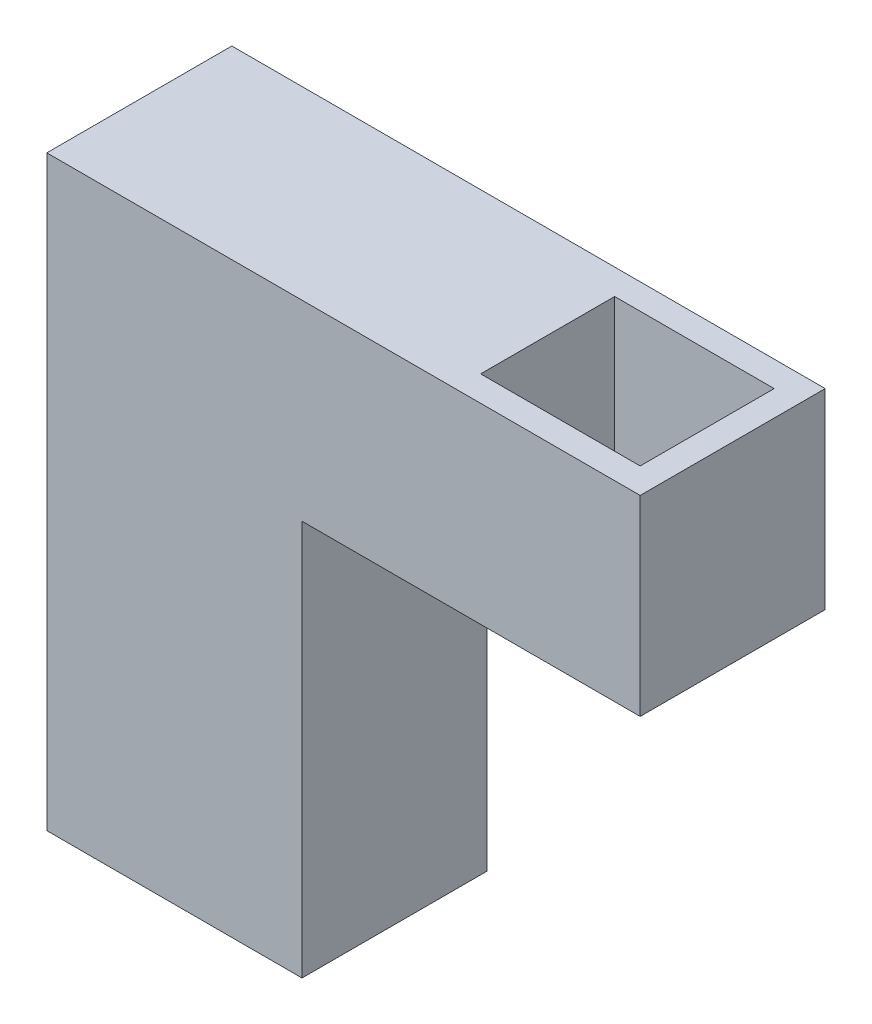
ISO-10303-21;
HEADER;
FILE_DESCRIPTION(('STEP AP214'),'2;1');
FILE_NAME('part.step','',(''),(''),'','','');
FILE_SCHEMA(('AUTOMOTIVE_DESIGN { 1 0 10303 214 1 1 1 1 }'));
ENDSEC;
DATA;
#1=APPLICATION_CONTEXT('core data for automotive mechanical design processes');
#2=APPLICATION_PROTOCOL_DEFINITION('international standard','automotive_design',2000,#1);
#3=PRODUCT_CONTEXT('',#1,'mechanical');
#4=PRODUCT('Part','Part','',(#3));
#5=PRODUCT_RELATED_PRODUCT_CATEGORY('part','',(#4));
#6=PRODUCT_DEFINITION_FORMATION('','',#4);
#7=PRODUCT_DEFINITION_CONTEXT('part definition',#1,'design');
#8=PRODUCT_DEFINITION('design','',#6,#7);
#9=PRODUCT_DEFINITION_SHAPE('','',#8);
#10=(LENGTH_UNIT() NAMED_UNIT(*) SI_UNIT(.MILLI.,.METRE.));
#11=(NAMED_UNIT(*) PLANE_ANGLE_UNIT() SI_UNIT($,.RADIAN.));
#12=(NAMED_UNIT(*) SI_UNIT($,.STERADIAN.) SOLID_ANGLE_UNIT());
#13=UNCERTAINTY_MEASURE_WITH_UNIT(LENGTH_MEASURE(1.E-05),#10,'distance_accuracy_value','');
#14=(GEOMETRIC_REPRESENTATION_CONTEXT(3) GLOBAL_UNCERTAINTY_ASSIGNED_CONTEXT((#13)) GLOBAL_UNIT_ASSIGNED_CONTEXT((#10,
#11,#12)) REPRESENTATION_CONTEXT('',''));
#15=CARTESIAN_POINT('',(0.,0.,0.));
#16=DIRECTION('',(0.,0.,1.));
#17=DIRECTION('',(1.,0.,0.));
#18=AXIS2_PLACEMENT_3D('',#15,#16,#17);
#19=CARTESIAN_POINT('',(0.,15.,0.));
#20=DIRECTION('',(0.,-1.,0.));
#21=DIRECTION('',(0.,0.,-1.));
#22=AXIS2_PLACEMENT_3D('',#19,#20,#21);
#23=PLANE('',#22);
#24=DIRECTION('',(-1.,0.,0.));
#25=VECTOR('',#24,1.);
#26=CARTESIAN_POINT('',(-2.,15.,-2.));
#27=LINE('',#26,#25);
#28=CARTESIAN_POINT('',(14.5,15.,-2.));
#29=VERTEX_POINT('',#28);
#30=CARTESIAN_POINT('',(-32.,15.,-2.));
#31=VERTEX_POINT('',#30);
#32=EDGE_CURVE('E206',#29,#31,#27,.T.);
#33=ORIENTED_EDGE('',*,*,#32,.T.);
#34=DIRECTION('',(0.,0.,-1.));
#35=VECTOR('',#34,1.);
#36=CARTESIAN_POINT('',(-32.,15.,12.5));
#37=LINE('',#36,#35);
#38=CARTESIAN_POINT('',(-32.,15.,12.5));
#39=VERTEX_POINT('',#38);
#40=EDGE_CURVE('E126',#39,#31,#37,.T.);
#41=ORIENTED_EDGE('',*,*,#40,.F.);
#42=DIRECTION('',(1.,0.,0.));
#43=VECTOR('',#42,1.);
#44=CARTESIAN_POINT('',(-2.,15.,12.5));
#45=LINE('',#44,#43);
#46=CARTESIAN_POINT('',(14.5,15.,12.5));
#47=VERTEX_POINT('',#46);
#48=EDGE_CURVE('E209',#39,#47,#45,.T.);
#49=ORIENTED_EDGE('',*,*,#48,.T.);
#50=DIRECTION('',(0.,0.,-1.));
#51=VECTOR('',#50,1.);
#52=CARTESIAN_POINT('',(14.5,15.,-2.));
#53=LINE('',#52,#51);
#54=EDGE_CURVE('E213',#47,#29,#53,.T.);
#55=ORIENTED_EDGE('',*,*,#54,.T.);
#56=EDGE_LOOP('',(#33,#41,#49,#55));
#57=FACE_BOUND('',#56,.T.);
#58=DIRECTION('',(0.,0.,1.));
#59=VECTOR('',#58,1.);
#60=CARTESIAN_POINT('',(0.,15.,0.));
#61=LINE('',#60,#59);
#62=CARTESIAN_POINT('',(0.,15.,0.));
#63=VERTEX_POINT('',#62);
#64=CARTESIAN_POINT('',(0.,15.,10.5));
#65=VERTEX_POINT('',#64);
#66=EDGE_CURVE('E165',#63,#65,#61,.T.);
#67=ORIENTED_EDGE('',*,*,#66,.F.);
#68=DIRECTION('',(-1.,0.,0.));
#69=VECTOR('',#68,1.);
#70=CARTESIAN_POINT('',(0.,15.,0.));
#71=LINE('',#70,#69);
#72=CARTESIAN_POINT('',(12.5,15.,0.));
#73=VERTEX_POINT('',#72);
#74=EDGE_CURVE('E175',#73,#63,#71,.T.);
#75=ORIENTED_EDGE('',*,*,#74,.F.);
#76=DIRECTION('',(0.,0.,-1.));
#77=VECTOR('',#76,1.);
#78=CARTESIAN_POINT('',(12.5,15.,0.));
#79=LINE('',#78,#77);
#80=CARTESIAN_POINT('',(12.5,15.,10.5));
#81=VERTEX_POINT('',#80);
#82=EDGE_CURVE('E172',#81,#73,#79,.T.);
#83=ORIENTED_EDGE('',*,*,#82,.F.);
#84=DIRECTION('',(1.,0.,0.));
#85=VECTOR('',#84,1.);
#86=CARTESIAN_POINT('',(0.,15.,10.5));
#87=LINE('',#86,#85);
#88=EDGE_CURVE('E168',#65,#81,#87,.T.);
#89=ORIENTED_EDGE('',*,*,#88,.F.);
#90=EDGE_LOOP('',(#67,#75,#83,#89));
#91=FACE_BOUND('',#90,.T.);
#92=ADVANCED_FACE('F39',(#57,#91),#23,.F.);
#93=CARTESIAN_POINT('',(0.,0.,0.));
#94=DIRECTION('',(0.,-1.,0.));
#95=DIRECTION('',(0.,0.,-1.));
#96=AXIS2_PLACEMENT_3D('',#93,#94,#95);
#97=PLANE('',#96);
#98=DIRECTION('',(0.,0.,1.));
#99=VECTOR('',#98,1.);
#100=CARTESIAN_POINT('',(-12.,0.,-2.));
#101=LINE('',#100,#99);
#102=CARTESIAN_POINT('',(-12.,0.,-2.));
#103=VERTEX_POINT('',#102);
#104=CARTESIAN_POINT('',(-12.,0.,12.5));
#105=VERTEX_POINT('',#104);
#106=EDGE_CURVE('E55',#103,#105,#101,.T.);
#107=ORIENTED_EDGE('',*,*,#106,.F.);
#108=DIRECTION('',(-1.,0.,0.));
#109=VECTOR('',#108,1.);
#110=CARTESIAN_POINT('',(-2.,0.,-2.));
#111=LINE('',#110,#109);
#112=CARTESIAN_POINT('',(14.5,0.,-2.));
#113=VERTEX_POINT('',#112);
#114=EDGE_CURVE('E205',#113,#103,#111,.T.);
#115=ORIENTED_EDGE('',*,*,#114,.F.);
#116=DIRECTION('',(0.,0.,-1.));
#117=VECTOR('',#116,1.);
#118=CARTESIAN_POINT('',(14.5,0.,-2.));
#119=LINE('',#118,#117);
#120=CARTESIAN_POINT('',(14.5,0.,12.5));
#121=VERTEX_POINT('',#120);
#122=EDGE_CURVE('E210',#121,#113,#119,.T.);
#123=ORIENTED_EDGE('',*,*,#122,.F.);
#124=DIRECTION('',(1.,0.,0.));
#125=VECTOR('',#124,1.);
#126=CARTESIAN_POINT('',(-2.,0.,12.5));
#127=LINE('',#126,#125);
#128=EDGE_CURVE('E218',#105,#121,#127,.T.);
#129=ORIENTED_EDGE('',*,*,#128,.F.);
#130=EDGE_LOOP('',(#107,#115,#123,#129));
#131=FACE_BOUND('',#130,.T.);
#132=DIRECTION('',(-1.,0.,0.));
#133=VECTOR('',#132,1.);
#134=CARTESIAN_POINT('',(0.,0.,0.));
#135=LINE('',#134,#133);
#136=CARTESIAN_POINT('',(12.5,0.,0.));
#137=VERTEX_POINT('',#136);
#138=CARTESIAN_POINT('',(0.,0.,0.));
#139=VERTEX_POINT('',#138);
#140=EDGE_CURVE('E169',#137,#139,#135,.T.);
#141=ORIENTED_EDGE('',*,*,#140,.T.);
#142=DIRECTION('',(0.,0.,1.));
#143=VECTOR('',#142,1.);
#144=CARTESIAN_POINT('',(0.,0.,0.));
#145=LINE('',#144,#143);
#146=CARTESIAN_POINT('',(0.,0.,10.5));
#147=VERTEX_POINT('',#146);
#148=EDGE_CURVE('E130',#139,#147,#145,.T.);
#149=ORIENTED_EDGE('',*,*,#148,.T.);
#150=DIRECTION('',(1.,0.,0.));
#151=VECTOR('',#150,1.);
#152=CARTESIAN_POINT('',(0.,0.,10.5));
#153=LINE('',#152,#151);
#154=CARTESIAN_POINT('',(12.5,0.,10.5));
#155=VERTEX_POINT('',#154);
#156=EDGE_CURVE('E182',#147,#155,#153,.T.);
#157=ORIENTED_EDGE('',*,*,#156,.T.);
#158=DIRECTION('',(0.,0.,-1.));
#159=VECTOR('',#158,1.);
#160=CARTESIAN_POINT('',(12.5,0.,0.));
#161=LINE('',#160,#159);
#162=EDGE_CURVE('E186',#155,#137,#161,.T.);
#163=ORIENTED_EDGE('',*,*,#162,.T.);
#164=EDGE_LOOP('',(#141,#149,#157,#163));
#165=FACE_BOUND('',#164,.T.);
#166=ADVANCED_FACE('F228',(#131,#165),#97,.T.);
#167=CARTESIAN_POINT('',(-2.,15.,-2.));
#168=DIRECTION('',(0.,0.,1.));
#169=DIRECTION('',(1.,0.,0.));
#170=AXIS2_PLACEMENT_3D('',#167,#168,#169);
#171=PLANE('',#170);
#172=ORIENTED_EDGE('',*,*,#114,.T.);
#173=DIRECTION('',(0.,1.,0.));
#174=VECTOR('',#173,1.);
#175=CARTESIAN_POINT('',(-12.,-31.,-2.));
#176=LINE('',#175,#174);
#177=CARTESIAN_POINT('',(-12.,-31.,-2.));
#178=VERTEX_POINT('',#177);
#179=EDGE_CURVE('E135',#178,#103,#176,.T.);
#180=ORIENTED_EDGE('',*,*,#179,.F.);
#181=DIRECTION('',(1.,0.,0.));
#182=VECTOR('',#181,1.);
#183=CARTESIAN_POINT('',(-32.,-31.,-2.));
#184=LINE('',#183,#182);
#185=CARTESIAN_POINT('',(-32.,-31.,-2.));
#186=VERTEX_POINT('',#185);
#187=EDGE_CURVE('E133',#186,#178,#184,.T.);
#188=ORIENTED_EDGE('',*,*,#187,.F.);
#189=DIRECTION('',(0.,-1.,0.));
#190=VECTOR('',#189,1.);
#191=CARTESIAN_POINT('',(-32.,0.,-2.));
#192=LINE('',#191,#190);
#193=EDGE_CURVE('E119',#31,#186,#192,.T.);
#194=ORIENTED_EDGE('',*,*,#193,.F.);
#195=ORIENTED_EDGE('',*,*,#32,.F.);
#196=DIRECTION('',(0.,-1.,0.));
#197=VECTOR('',#196,1.);
#198=CARTESIAN_POINT('',(14.5,15.,-2.));
#199=LINE('',#198,#197);
#200=EDGE_CURVE('E48',#29,#113,#199,.T.);
#201=ORIENTED_EDGE('',*,*,#200,.T.);
#202=EDGE_LOOP('',(#172,#180,#188,#194,#195,#201));
#203=FACE_BOUND('',#202,.T.);
#204=ADVANCED_FACE('F41',(#203),#171,.F.);
#205=CARTESIAN_POINT('',(-2.,15.,12.5));
#206=DIRECTION('',(0.,0.,-1.));
#207=DIRECTION('',(-1.,0.,0.));
#208=AXIS2_PLACEMENT_3D('',#205,#206,#207);
#209=PLANE('',#208);
#210=DIRECTION('',(0.,1.,0.));
#211=VECTOR('',#210,1.);
#212=CARTESIAN_POINT('',(-32.,0.,12.5));
#213=LINE('',#212,#211);
#214=CARTESIAN_POINT('',(-32.,-31.,12.5));
#215=VERTEX_POINT('',#214);
#216=EDGE_CURVE('E160',#215,#39,#213,.T.);
#217=ORIENTED_EDGE('',*,*,#216,.F.);
#218=DIRECTION('',(-1.,0.,0.));
#219=VECTOR('',#218,1.);
#220=CARTESIAN_POINT('',(-32.,-31.,12.5));
#221=LINE('',#220,#219);
#222=CARTESIAN_POINT('',(-12.,-31.,12.5));
#223=VERTEX_POINT('',#222);
#224=EDGE_CURVE('E144',#223,#215,#221,.T.);
#225=ORIENTED_EDGE('',*,*,#224,.F.);
#226=DIRECTION('',(0.,1.,0.));
#227=VECTOR('',#226,1.);
#228=CARTESIAN_POINT('',(-12.,-31.,12.5));
#229=LINE('',#228,#227);
#230=EDGE_CURVE('E153',#223,#105,#229,.T.);
#231=ORIENTED_EDGE('',*,*,#230,.T.);
#232=ORIENTED_EDGE('',*,*,#128,.T.);
#233=DIRECTION('',(0.,-1.,0.));
#234=VECTOR('',#233,1.);
#235=CARTESIAN_POINT('',(14.5,15.,12.5));
#236=LINE('',#235,#234);
#237=EDGE_CURVE('E11',#47,#121,#236,.T.);
#238=ORIENTED_EDGE('',*,*,#237,.F.);
#239=ORIENTED_EDGE('',*,*,#48,.F.);
#240=EDGE_LOOP('',(#217,#225,#231,#232,#238,#239));
#241=FACE_BOUND('',#240,.T.);
#242=ADVANCED_FACE('F233',(#241),#209,.F.);
#243=CARTESIAN_POINT('',(14.5,15.,-2.));
#244=DIRECTION('',(-1.,0.,0.));
#245=DIRECTION('',(0.,0.,1.));
#246=AXIS2_PLACEMENT_3D('',#243,#244,#245);
#247=PLANE('',#246);
#248=ORIENTED_EDGE('',*,*,#122,.T.);
#249=ORIENTED_EDGE('',*,*,#200,.F.);
#250=ORIENTED_EDGE('',*,*,#54,.F.);
#251=ORIENTED_EDGE('',*,*,#237,.T.);
#252=EDGE_LOOP('',(#248,#249,#250,#251));
#253=FACE_BOUND('',#252,.T.);
#254=ADVANCED_FACE('F230',(#253),#247,.F.);
#255=CARTESIAN_POINT('',(0.,15.,0.));
#256=DIRECTION('',(1.,0.,0.));
#257=DIRECTION('',(0.,0.,-1.));
#258=AXIS2_PLACEMENT_3D('',#255,#256,#257);
#259=PLANE('',#258);
#260=ORIENTED_EDGE('',*,*,#148,.F.);
#261=DIRECTION('',(0.,-1.,0.));
#262=VECTOR('',#261,1.);
#263=CARTESIAN_POINT('',(0.,15.,0.));
#264=LINE('',#263,#262);
#265=EDGE_CURVE('E178',#63,#139,#264,.T.);
#266=ORIENTED_EDGE('',*,*,#265,.F.);
#267=ORIENTED_EDGE('',*,*,#66,.T.);
#268=DIRECTION('',(0.,-1.,0.));
#269=VECTOR('',#268,1.);
#270=CARTESIAN_POINT('',(0.,15.,10.5));
#271=LINE('',#270,#269);
#272=EDGE_CURVE('E201',#65,#147,#271,.T.);
#273=ORIENTED_EDGE('',*,*,#272,.T.);
#274=EDGE_LOOP('',(#260,#266,#267,#273));
#275=FACE_BOUND('',#274,.T.);
#276=ADVANCED_FACE('F255',(#275),#259,.T.);
#277=CARTESIAN_POINT('',(0.,15.,10.5));
#278=DIRECTION('',(0.,0.,-1.));
#279=DIRECTION('',(-1.,0.,0.));
#280=AXIS2_PLACEMENT_3D('',#277,#278,#279);
#281=PLANE('',#280);
#282=ORIENTED_EDGE('',*,*,#156,.F.);
#283=ORIENTED_EDGE('',*,*,#272,.F.);
#284=ORIENTED_EDGE('',*,*,#88,.T.);
#285=DIRECTION('',(0.,-1.,0.));
#286=VECTOR('',#285,1.);
#287=CARTESIAN_POINT('',(12.5,15.,10.5));
#288=LINE('',#287,#286);
#289=EDGE_CURVE('E198',#81,#155,#288,.T.);
#290=ORIENTED_EDGE('',*,*,#289,.T.);
#291=EDGE_LOOP('',(#282,#283,#284,#290));
#292=FACE_BOUND('',#291,.T.);
#293=ADVANCED_FACE('F294',(#292),#281,.T.);
#294=CARTESIAN_POINT('',(12.5,15.,0.));
#295=DIRECTION('',(-1.,0.,0.));
#296=DIRECTION('',(0.,0.,1.));
#297=AXIS2_PLACEMENT_3D('',#294,#295,#296);
#298=PLANE('',#297);
#299=ORIENTED_EDGE('',*,*,#162,.F.);
#300=ORIENTED_EDGE('',*,*,#289,.F.);
#301=ORIENTED_EDGE('',*,*,#82,.T.);
#302=DIRECTION('',(0.,-1.,0.));
#303=VECTOR('',#302,1.);
#304=CARTESIAN_POINT('',(12.5,15.,0.));
#305=LINE('',#304,#303);
#306=EDGE_CURVE('E63',#73,#137,#305,.T.);
#307=ORIENTED_EDGE('',*,*,#306,.T.);
#308=EDGE_LOOP('',(#299,#300,#301,#307));
#309=FACE_BOUND('',#308,.T.);
#310=ADVANCED_FACE('F285',(#309),#298,.T.);
#311=CARTESIAN_POINT('',(0.,15.,0.));
#312=DIRECTION('',(0.,0.,1.));
#313=DIRECTION('',(1.,0.,0.));
#314=AXIS2_PLACEMENT_3D('',#311,#312,#313);
#315=PLANE('',#314);
#316=ORIENTED_EDGE('',*,*,#140,.F.);
#317=ORIENTED_EDGE('',*,*,#306,.F.);
#318=ORIENTED_EDGE('',*,*,#74,.T.);
#319=ORIENTED_EDGE('',*,*,#265,.T.);
#320=EDGE_LOOP('',(#316,#317,#318,#319));
#321=FACE_BOUND('',#320,.T.);
#322=ADVANCED_FACE('F244',(#321),#315,.T.);
#323=CARTESIAN_POINT('',(-32.,0.,0.));
#324=DIRECTION('',(-1.,0.,0.));
#325=DIRECTION('',(0.,0.,1.));
#326=AXIS2_PLACEMENT_3D('',#323,#324,#325);
#327=PLANE('',#326);
#328=ORIENTED_EDGE('',*,*,#216,.T.);
#329=ORIENTED_EDGE('',*,*,#40,.T.);
#330=ORIENTED_EDGE('',*,*,#193,.T.);
#331=DIRECTION('',(0.,0.,-1.));
#332=VECTOR('',#331,1.);
#333=CARTESIAN_POINT('',(-32.,-31.,-2.));
#334=LINE('',#333,#332);
#335=EDGE_CURVE('E124',#215,#186,#334,.T.);
#336=ORIENTED_EDGE('',*,*,#335,.F.);
#337=EDGE_LOOP('',(#328,#329,#330,#336));
#338=FACE_BOUND('',#337,.T.);
#339=ADVANCED_FACE('F122',(#338),#327,.T.);
#340=CARTESIAN_POINT('',(-12.,-31.,-2.));
#341=DIRECTION('',(-1.,0.,0.));
#342=DIRECTION('',(0.,0.,1.));
#343=AXIS2_PLACEMENT_3D('',#340,#341,#342);
#344=PLANE('',#343);
#345=ORIENTED_EDGE('',*,*,#106,.T.);
#346=ORIENTED_EDGE('',*,*,#230,.F.);
#347=DIRECTION('',(0.,0.,1.));
#348=VECTOR('',#347,1.);
#349=CARTESIAN_POINT('',(-12.,-31.,-2.));
#350=LINE('',#349,#348);
#351=EDGE_CURVE('E139',#178,#223,#350,.T.);
#352=ORIENTED_EDGE('',*,*,#351,.F.);
#353=ORIENTED_EDGE('',*,*,#179,.T.);
#354=EDGE_LOOP('',(#345,#346,#352,#353));
#355=FACE_BOUND('',#354,.T.);
#356=ADVANCED_FACE('F236',(#355),#344,.F.);
#357=CARTESIAN_POINT('',(0.,-31.,0.));
#358=DIRECTION('',(0.,1.,0.));
#359=DIRECTION('',(0.,0.,1.));
#360=AXIS2_PLACEMENT_3D('',#357,#358,#359);
#361=PLANE('',#360);
#362=ORIENTED_EDGE('',*,*,#335,.T.);
#363=ORIENTED_EDGE('',*,*,#187,.T.);
#364=ORIENTED_EDGE('',*,*,#351,.T.);
#365=ORIENTED_EDGE('',*,*,#224,.T.);
#366=EDGE_LOOP('',(#362,#363,#364,#365));
#367=FACE_BOUND('',#366,.T.);
#368=ADVANCED_FACE('F142',(#367),#361,.F.);
#369=CLOSED_SHELL('',(#92,#166,#204,#242,#254,#276,#293,#310,#322,#339,#356,#368));
#370=MANIFOLD_SOLID_BREP('B2',#369);
#371=ADVANCED_BREP_SHAPE_REPRESENTATION('',(#18,#370),#14);
#372=SHAPE_DEFINITION_REPRESENTATION(#9,#371);
ENDSEC;
END-ISO-10303-21;
